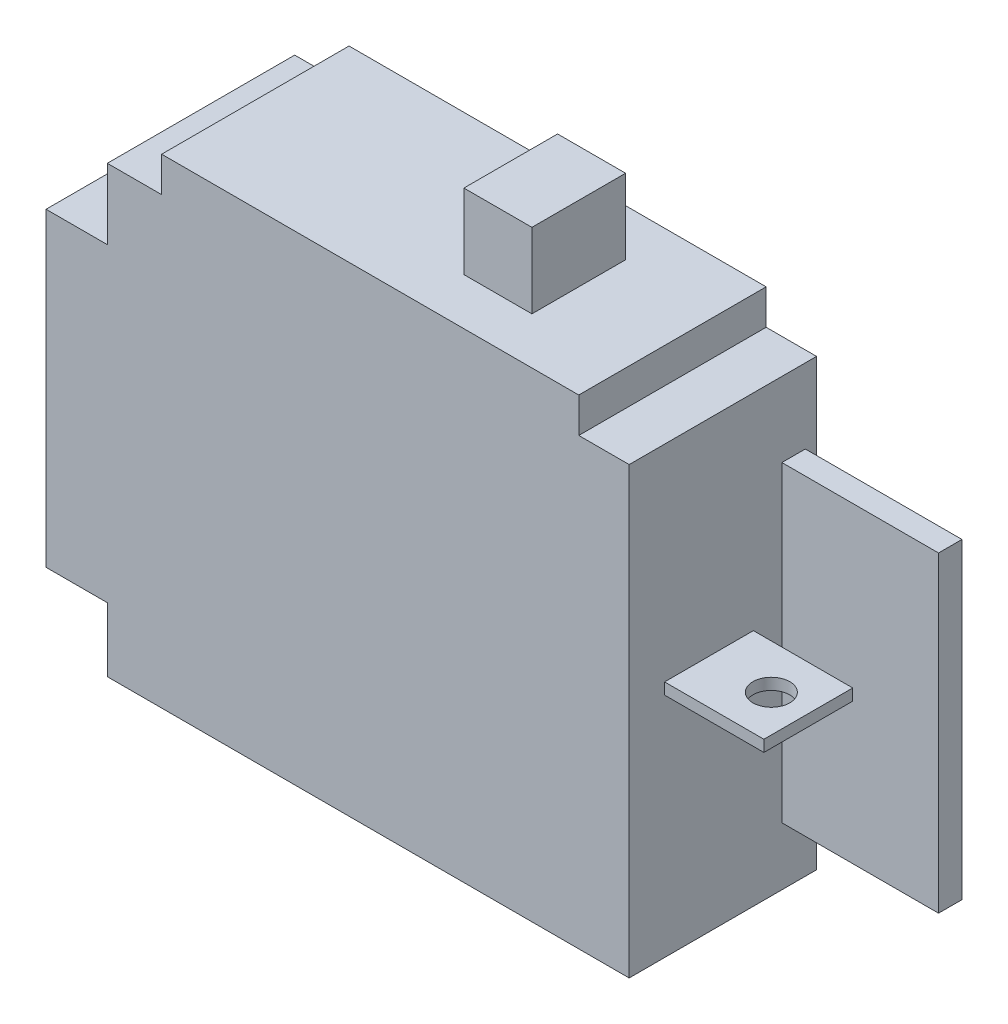
ISO-10303-21;
HEADER;
FILE_DESCRIPTION(('STEP AP214'),'2;1');
FILE_NAME('part.step','',(''),(''),'','','');
FILE_SCHEMA(('AUTOMOTIVE_DESIGN { 1 0 10303 214 1 1 1 1 }'));
ENDSEC;
DATA;
#1=APPLICATION_CONTEXT('core data for automotive mechanical design processes');
#2=APPLICATION_PROTOCOL_DEFINITION('international standard','automotive_design',2000,#1);
#3=PRODUCT_CONTEXT('',#1,'mechanical');
#4=PRODUCT('Part','Part','',(#3));
#5=PRODUCT_RELATED_PRODUCT_CATEGORY('part','',(#4));
#6=PRODUCT_DEFINITION_FORMATION('','',#4);
#7=PRODUCT_DEFINITION_CONTEXT('part definition',#1,'design');
#8=PRODUCT_DEFINITION('design','',#6,#7);
#9=PRODUCT_DEFINITION_SHAPE('','',#8);
#10=(LENGTH_UNIT() NAMED_UNIT(*) SI_UNIT(.MILLI.,.METRE.));
#11=(NAMED_UNIT(*) PLANE_ANGLE_UNIT() SI_UNIT($,.RADIAN.));
#12=(NAMED_UNIT(*) SI_UNIT($,.STERADIAN.) SOLID_ANGLE_UNIT());
#13=UNCERTAINTY_MEASURE_WITH_UNIT(LENGTH_MEASURE(1.E-05),#10,'distance_accuracy_value','');
#14=(GEOMETRIC_REPRESENTATION_CONTEXT(3) GLOBAL_UNCERTAINTY_ASSIGNED_CONTEXT((#13)) GLOBAL_UNIT_ASSIGNED_CONTEXT((#10,
#11,#12)) REPRESENTATION_CONTEXT('',''));
#15=CARTESIAN_POINT('',(0.,0.,0.));
#16=DIRECTION('',(0.,0.,1.));
#17=DIRECTION('',(1.,0.,0.));
#18=AXIS2_PLACEMENT_3D('',#15,#16,#17);
#19=CARTESIAN_POINT('',(6.61669999999999,45.0469,25.4));
#20=DIRECTION('',(1.,0.,0.));
#21=DIRECTION('',(0.,0.,-1.));
#22=AXIS2_PLACEMENT_3D('',#19,#20,#21);
#23=PLANE('',#22);
#24=DIRECTION('',(0.,1.,0.));
#25=VECTOR('',#24,1.);
#26=CARTESIAN_POINT('',(6.61669999999999,45.0469,6.35));
#27=LINE('',#26,#25);
#28=CARTESIAN_POINT('',(6.61669999999999,34.8869,6.35));
#29=VERTEX_POINT('',#28);
#30=CARTESIAN_POINT('',(6.61669999999999,45.0469,6.35));
#31=VERTEX_POINT('',#30);
#32=EDGE_CURVE('E206',#29,#31,#27,.T.);
#33=ORIENTED_EDGE('',*,*,#32,.F.);
#34=DIRECTION('',(0.,0.,-1.));
#35=VECTOR('',#34,1.);
#36=CARTESIAN_POINT('',(6.61669999999999,34.8869,25.4));
#37=LINE('',#36,#35);
#38=CARTESIAN_POINT('',(6.61669999999999,34.8869,19.05));
#39=VERTEX_POINT('',#38);
#40=EDGE_CURVE('E11',#39,#29,#37,.T.);
#41=ORIENTED_EDGE('',*,*,#40,.F.);
#42=DIRECTION('',(0.,-1.,0.));
#43=VECTOR('',#42,1.);
#44=CARTESIAN_POINT('',(6.61669999999999,45.0469,19.05));
#45=LINE('',#44,#43);
#46=CARTESIAN_POINT('',(6.61669999999999,45.0469,19.05));
#47=VERTEX_POINT('',#46);
#48=EDGE_CURVE('E476',#47,#39,#45,.T.);
#49=ORIENTED_EDGE('',*,*,#48,.F.);
#50=DIRECTION('',(0.,0.,-1.));
#51=VECTOR('',#50,1.);
#52=CARTESIAN_POINT('',(6.61669999999999,45.0469,25.4));
#53=LINE('',#52,#51);
#54=EDGE_CURVE('E229',#47,#31,#53,.T.);
#55=ORIENTED_EDGE('',*,*,#54,.T.);
#56=EDGE_LOOP('',(#33,#41,#49,#55));
#57=FACE_BOUND('',#56,.T.);
#58=ADVANCED_FACE('F38',(#57),#23,.F.);
#59=CARTESIAN_POINT('',(15.8369,34.8869,25.4));
#60=DIRECTION('',(-1.,0.,0.));
#61=DIRECTION('',(0.,0.,1.));
#62=AXIS2_PLACEMENT_3D('',#59,#60,#61);
#63=PLANE('',#62);
#64=DIRECTION('',(0.,-1.,0.));
#65=VECTOR('',#64,1.);
#66=CARTESIAN_POINT('',(15.8369,45.0469,6.35));
#67=LINE('',#66,#65);
#68=CARTESIAN_POINT('',(15.8369,45.0469,6.35));
#69=VERTEX_POINT('',#68);
#70=CARTESIAN_POINT('',(15.8369,34.8869,6.35));
#71=VERTEX_POINT('',#70);
#72=EDGE_CURVE('E207',#69,#71,#67,.T.);
#73=ORIENTED_EDGE('',*,*,#72,.F.);
#74=DIRECTION('',(0.,0.,-1.));
#75=VECTOR('',#74,1.);
#76=CARTESIAN_POINT('',(15.8369,45.0469,25.4));
#77=LINE('',#76,#75);
#78=CARTESIAN_POINT('',(15.8369,45.0469,19.05));
#79=VERTEX_POINT('',#78);
#80=EDGE_CURVE('E223',#79,#69,#77,.T.);
#81=ORIENTED_EDGE('',*,*,#80,.F.);
#82=DIRECTION('',(0.,1.,0.));
#83=VECTOR('',#82,1.);
#84=CARTESIAN_POINT('',(15.8369,45.0469,19.05));
#85=LINE('',#84,#83);
#86=CARTESIAN_POINT('',(15.8369,34.8869,19.05));
#87=VERTEX_POINT('',#86);
#88=EDGE_CURVE('E220',#87,#79,#85,.T.);
#89=ORIENTED_EDGE('',*,*,#88,.F.);
#90=DIRECTION('',(0.,0.,-1.));
#91=VECTOR('',#90,1.);
#92=CARTESIAN_POINT('',(15.8369,34.8869,25.4));
#93=LINE('',#92,#91);
#94=EDGE_CURVE('E201',#87,#71,#93,.T.);
#95=ORIENTED_EDGE('',*,*,#94,.T.);
#96=EDGE_LOOP('',(#73,#81,#89,#95));
#97=FACE_BOUND('',#96,.T.);
#98=ADVANCED_FACE('F219',(#97),#63,.F.);
#99=CARTESIAN_POINT('',(15.8369,45.0469,25.4));
#100=DIRECTION('',(0.,-1.,0.));
#101=DIRECTION('',(0.,0.,-1.));
#102=AXIS2_PLACEMENT_3D('',#99,#100,#101);
#103=PLANE('',#102);
#104=DIRECTION('',(1.,0.,0.));
#105=VECTOR('',#104,1.);
#106=CARTESIAN_POINT('',(15.8369,45.0469,6.35));
#107=LINE('',#106,#105);
#108=EDGE_CURVE('E212',#31,#69,#107,.T.);
#109=ORIENTED_EDGE('',*,*,#108,.F.);
#110=ORIENTED_EDGE('',*,*,#54,.F.);
#111=DIRECTION('',(-1.,0.,0.));
#112=VECTOR('',#111,1.);
#113=CARTESIAN_POINT('',(6.61669999999999,45.0469,19.05));
#114=LINE('',#113,#112);
#115=EDGE_CURVE('E468',#79,#47,#114,.T.);
#116=ORIENTED_EDGE('',*,*,#115,.F.);
#117=ORIENTED_EDGE('',*,*,#80,.T.);
#118=EDGE_LOOP('',(#109,#110,#116,#117));
#119=FACE_BOUND('',#118,.T.);
#120=ADVANCED_FACE('F484',(#119),#103,.F.);
#121=CARTESIAN_POINT('',(-28.0035,30.1371,25.4));
#122=DIRECTION('',(-1.,0.,0.));
#123=DIRECTION('',(0.,0.,1.));
#124=AXIS2_PLACEMENT_3D('',#121,#122,#123);
#125=PLANE('',#124);
#126=DIRECTION('',(0.,1.,0.));
#127=VECTOR('',#126,1.);
#128=CARTESIAN_POINT('',(-28.0035,30.1371,0.));
#129=LINE('',#128,#127);
#130=CARTESIAN_POINT('',(-28.0035,30.1371,0.));
#131=VERTEX_POINT('',#130);
#132=CARTESIAN_POINT('',(-28.0035,34.8869,0.));
#133=VERTEX_POINT('',#132);
#134=EDGE_CURVE('E270',#131,#133,#129,.T.);
#135=ORIENTED_EDGE('',*,*,#134,.F.);
#136=DIRECTION('',(0.,0.,-1.));
#137=VECTOR('',#136,1.);
#138=CARTESIAN_POINT('',(-28.0035,30.1371,25.4));
#139=LINE('',#138,#137);
#140=CARTESIAN_POINT('',(-28.0035,30.1371,25.4));
#141=VERTEX_POINT('',#140);
#142=EDGE_CURVE('E260',#141,#131,#139,.T.);
#143=ORIENTED_EDGE('',*,*,#142,.F.);
#144=DIRECTION('',(0.,1.,0.));
#145=VECTOR('',#144,1.);
#146=CARTESIAN_POINT('',(-28.0035,30.1371,25.4));
#147=LINE('',#146,#145);
#148=CARTESIAN_POINT('',(-28.0035,34.8869,25.4));
#149=VERTEX_POINT('',#148);
#150=EDGE_CURVE('E273',#141,#149,#147,.T.);
#151=ORIENTED_EDGE('',*,*,#150,.T.);
#152=DIRECTION('',(0.,0.,-1.));
#153=VECTOR('',#152,1.);
#154=CARTESIAN_POINT('',(-28.0035,34.8869,25.4));
#155=LINE('',#154,#153);
#156=EDGE_CURVE('E46',#149,#133,#155,.T.);
#157=ORIENTED_EDGE('',*,*,#156,.T.);
#158=EDGE_LOOP('',(#135,#143,#151,#157));
#159=FACE_BOUND('',#158,.T.);
#160=ADVANCED_FACE('F269',(#159),#125,.T.);
#161=CARTESIAN_POINT('',(-35.3695,30.1371,25.4));
#162=DIRECTION('',(0.,1.,0.));
#163=DIRECTION('',(0.,0.,1.));
#164=AXIS2_PLACEMENT_3D('',#161,#162,#163);
#165=PLANE('',#164);
#166=DIRECTION('',(1.,0.,0.));
#167=VECTOR('',#166,1.);
#168=CARTESIAN_POINT('',(-35.3695,30.1371,0.));
#169=LINE('',#168,#167);
#170=CARTESIAN_POINT('',(-35.3695,30.1371,0.));
#171=VERTEX_POINT('',#170);
#172=EDGE_CURVE('E283',#171,#131,#169,.T.);
#173=ORIENTED_EDGE('',*,*,#172,.F.);
#174=DIRECTION('',(0.,0.,-1.));
#175=VECTOR('',#174,1.);
#176=CARTESIAN_POINT('',(-35.3695,30.1371,25.4));
#177=LINE('',#176,#175);
#178=CARTESIAN_POINT('',(-35.3695,30.1371,25.4));
#179=VERTEX_POINT('',#178);
#180=EDGE_CURVE('E257',#179,#171,#177,.T.);
#181=ORIENTED_EDGE('',*,*,#180,.F.);
#182=DIRECTION('',(1.,0.,0.));
#183=VECTOR('',#182,1.);
#184=CARTESIAN_POINT('',(-35.3695,30.1371,25.4));
#185=LINE('',#184,#183);
#186=EDGE_CURVE('E374',#179,#141,#185,.T.);
#187=ORIENTED_EDGE('',*,*,#186,.T.);
#188=ORIENTED_EDGE('',*,*,#142,.T.);
#189=EDGE_LOOP('',(#173,#181,#187,#188));
#190=FACE_BOUND('',#189,.T.);
#191=ADVANCED_FACE('F535',(#190),#165,.T.);
#192=CARTESIAN_POINT('',(-35.3695,20.5867,25.4));
#193=DIRECTION('',(-1.,0.,0.));
#194=DIRECTION('',(0.,0.,1.));
#195=AXIS2_PLACEMENT_3D('',#192,#193,#194);
#196=PLANE('',#195);
#197=DIRECTION('',(0.,1.,0.));
#198=VECTOR('',#197,1.);
#199=CARTESIAN_POINT('',(-35.3695,20.5867,0.));
#200=LINE('',#199,#198);
#201=CARTESIAN_POINT('',(-35.3695,20.5867,0.));
#202=VERTEX_POINT('',#201);
#203=EDGE_CURVE('E289',#202,#171,#200,.T.);
#204=ORIENTED_EDGE('',*,*,#203,.F.);
#205=DIRECTION('',(0.,0.,-1.));
#206=VECTOR('',#205,1.);
#207=CARTESIAN_POINT('',(-35.3695,20.5867,25.4));
#208=LINE('',#207,#206);
#209=CARTESIAN_POINT('',(-35.3695,20.5867,25.4));
#210=VERTEX_POINT('',#209);
#211=EDGE_CURVE('E254',#210,#202,#208,.T.);
#212=ORIENTED_EDGE('',*,*,#211,.F.);
#213=DIRECTION('',(0.,1.,0.));
#214=VECTOR('',#213,1.);
#215=CARTESIAN_POINT('',(-35.3695,20.5867,25.4));
#216=LINE('',#215,#214);
#217=EDGE_CURVE('E370',#210,#179,#216,.T.);
#218=ORIENTED_EDGE('',*,*,#217,.T.);
#219=ORIENTED_EDGE('',*,*,#180,.T.);
#220=EDGE_LOOP('',(#204,#212,#218,#219));
#221=FACE_BOUND('',#220,.T.);
#222=ADVANCED_FACE('F531',(#221),#196,.T.);
#223=CARTESIAN_POINT('',(-43.6753,20.5867,25.4));
#224=DIRECTION('',(0.,1.,0.));
#225=DIRECTION('',(0.,0.,1.));
#226=AXIS2_PLACEMENT_3D('',#223,#224,#225);
#227=PLANE('',#226);
#228=DIRECTION('',(1.,0.,0.));
#229=VECTOR('',#228,1.);
#230=CARTESIAN_POINT('',(-43.6753,20.5867,0.));
#231=LINE('',#230,#229);
#232=CARTESIAN_POINT('',(-43.6753,20.5867,0.));
#233=VERTEX_POINT('',#232);
#234=EDGE_CURVE('E300',#233,#202,#231,.T.);
#235=ORIENTED_EDGE('',*,*,#234,.F.);
#236=DIRECTION('',(0.,0.,-1.));
#237=VECTOR('',#236,1.);
#238=CARTESIAN_POINT('',(-43.6753,20.5867,25.4));
#239=LINE('',#238,#237);
#240=CARTESIAN_POINT('',(-43.6753,20.5867,25.4));
#241=VERTEX_POINT('',#240);
#242=EDGE_CURVE('E251',#241,#233,#239,.T.);
#243=ORIENTED_EDGE('',*,*,#242,.F.);
#244=DIRECTION('',(1.,0.,0.));
#245=VECTOR('',#244,1.);
#246=CARTESIAN_POINT('',(-43.6753,20.5867,25.4));
#247=LINE('',#246,#245);
#248=EDGE_CURVE('E366',#241,#210,#247,.T.);
#249=ORIENTED_EDGE('',*,*,#248,.T.);
#250=ORIENTED_EDGE('',*,*,#211,.T.);
#251=EDGE_LOOP('',(#235,#243,#249,#250));
#252=FACE_BOUND('',#251,.T.);
#253=ADVANCED_FACE('F527',(#252),#227,.T.);
#254=CARTESIAN_POINT('',(-43.6753,-21.4503,25.4));
#255=DIRECTION('',(-1.,0.,0.));
#256=DIRECTION('',(0.,0.,1.));
#257=AXIS2_PLACEMENT_3D('',#254,#255,#256);
#258=PLANE('',#257);
#259=DIRECTION('',(0.,1.,0.));
#260=VECTOR('',#259,1.);
#261=CARTESIAN_POINT('',(-43.6753,-21.4503,0.));
#262=LINE('',#261,#260);
#263=CARTESIAN_POINT('',(-43.6753,-21.4503,0.));
#264=VERTEX_POINT('',#263);
#265=EDGE_CURVE('E304',#264,#233,#262,.T.);
#266=ORIENTED_EDGE('',*,*,#265,.F.);
#267=DIRECTION('',(0.,0.,-1.));
#268=VECTOR('',#267,1.);
#269=CARTESIAN_POINT('',(-43.6753,-21.4503,25.4));
#270=LINE('',#269,#268);
#271=CARTESIAN_POINT('',(-43.6753,-21.4503,25.4));
#272=VERTEX_POINT('',#271);
#273=EDGE_CURVE('E248',#272,#264,#270,.T.);
#274=ORIENTED_EDGE('',*,*,#273,.F.);
#275=DIRECTION('',(0.,1.,0.));
#276=VECTOR('',#275,1.);
#277=CARTESIAN_POINT('',(-43.6753,-21.4503,25.4));
#278=LINE('',#277,#276);
#279=EDGE_CURVE('E362',#272,#241,#278,.T.);
#280=ORIENTED_EDGE('',*,*,#279,.T.);
#281=ORIENTED_EDGE('',*,*,#242,.T.);
#282=EDGE_LOOP('',(#266,#274,#280,#281));
#283=FACE_BOUND('',#282,.T.);
#284=ADVANCED_FACE('F523',(#283),#258,.T.);
#285=CARTESIAN_POINT('',(-35.3695,-21.4503,25.4));
#286=DIRECTION('',(0.,-1.,0.));
#287=DIRECTION('',(0.,0.,-1.));
#288=AXIS2_PLACEMENT_3D('',#285,#286,#287);
#289=PLANE('',#288);
#290=DIRECTION('',(-1.,0.,0.));
#291=VECTOR('',#290,1.);
#292=CARTESIAN_POINT('',(-35.3695,-21.4503,0.));
#293=LINE('',#292,#291);
#294=CARTESIAN_POINT('',(-35.3695,-21.4503,0.));
#295=VERTEX_POINT('',#294);
#296=EDGE_CURVE('E308',#295,#264,#293,.T.);
#297=ORIENTED_EDGE('',*,*,#296,.F.);
#298=DIRECTION('',(0.,0.,-1.));
#299=VECTOR('',#298,1.);
#300=CARTESIAN_POINT('',(-35.3695,-21.4503,25.4));
#301=LINE('',#300,#299);
#302=CARTESIAN_POINT('',(-35.3695,-21.4503,25.4));
#303=VERTEX_POINT('',#302);
#304=EDGE_CURVE('E245',#303,#295,#301,.T.);
#305=ORIENTED_EDGE('',*,*,#304,.F.);
#306=DIRECTION('',(-1.,0.,0.));
#307=VECTOR('',#306,1.);
#308=CARTESIAN_POINT('',(-35.3695,-21.4503,25.4));
#309=LINE('',#308,#307);
#310=EDGE_CURVE('E358',#303,#272,#309,.T.);
#311=ORIENTED_EDGE('',*,*,#310,.T.);
#312=ORIENTED_EDGE('',*,*,#273,.T.);
#313=EDGE_LOOP('',(#297,#305,#311,#312));
#314=FACE_BOUND('',#313,.T.);
#315=ADVANCED_FACE('F519',(#314),#289,.T.);
#316=CARTESIAN_POINT('',(-35.3695,-30.1371,25.4));
#317=DIRECTION('',(-1.,0.,0.));
#318=DIRECTION('',(0.,0.,1.));
#319=AXIS2_PLACEMENT_3D('',#316,#317,#318);
#320=PLANE('',#319);
#321=DIRECTION('',(0.,1.,0.));
#322=VECTOR('',#321,1.);
#323=CARTESIAN_POINT('',(-35.3695,-30.1371,0.));
#324=LINE('',#323,#322);
#325=CARTESIAN_POINT('',(-35.3695,-30.1371,0.));
#326=VERTEX_POINT('',#325);
#327=EDGE_CURVE('E312',#326,#295,#324,.T.);
#328=ORIENTED_EDGE('',*,*,#327,.F.);
#329=DIRECTION('',(0.,0.,-1.));
#330=VECTOR('',#329,1.);
#331=CARTESIAN_POINT('',(-35.3695,-30.1371,25.4));
#332=LINE('',#331,#330);
#333=CARTESIAN_POINT('',(-35.3695,-30.1371,25.4));
#334=VERTEX_POINT('',#333);
#335=EDGE_CURVE('E242',#334,#326,#332,.T.);
#336=ORIENTED_EDGE('',*,*,#335,.F.);
#337=DIRECTION('',(0.,1.,0.));
#338=VECTOR('',#337,1.);
#339=CARTESIAN_POINT('',(-35.3695,-30.1371,25.4));
#340=LINE('',#339,#338);
#341=EDGE_CURVE('E354',#334,#303,#340,.T.);
#342=ORIENTED_EDGE('',*,*,#341,.T.);
#343=ORIENTED_EDGE('',*,*,#304,.T.);
#344=EDGE_LOOP('',(#328,#336,#342,#343));
#345=FACE_BOUND('',#344,.T.);
#346=ADVANCED_FACE('F515',(#345),#320,.T.);
#347=CARTESIAN_POINT('',(-35.3695,-30.1371,25.4));
#348=DIRECTION('',(0.,1.,0.));
#349=DIRECTION('',(0.,0.,1.));
#350=AXIS2_PLACEMENT_3D('',#347,#348,#349);
#351=PLANE('',#350);
#352=DIRECTION('',(1.,0.,0.));
#353=VECTOR('',#352,1.);
#354=CARTESIAN_POINT('',(-35.3695,-30.1371,0.));
#355=LINE('',#354,#353);
#356=CARTESIAN_POINT('',(35.3695,-30.1371,0.));
#357=VERTEX_POINT('',#356);
#358=EDGE_CURVE('E316',#326,#357,#355,.T.);
#359=ORIENTED_EDGE('',*,*,#358,.T.);
#360=DIRECTION('',(0.,0.,-1.));
#361=VECTOR('',#360,1.);
#362=CARTESIAN_POINT('',(35.3695,-30.1371,25.4));
#363=LINE('',#362,#361);
#364=CARTESIAN_POINT('',(35.3695,-30.1371,25.4));
#365=VERTEX_POINT('',#364);
#366=EDGE_CURVE('E238',#365,#357,#363,.T.);
#367=ORIENTED_EDGE('',*,*,#366,.F.);
#368=DIRECTION('',(1.,0.,0.));
#369=VECTOR('',#368,1.);
#370=CARTESIAN_POINT('',(-35.3695,-30.1371,25.4));
#371=LINE('',#370,#369);
#372=EDGE_CURVE('E349',#334,#365,#371,.T.);
#373=ORIENTED_EDGE('',*,*,#372,.F.);
#374=ORIENTED_EDGE('',*,*,#335,.T.);
#375=EDGE_LOOP('',(#359,#367,#373,#374));
#376=FACE_BOUND('',#375,.T.);
#377=ADVANCED_FACE('F512',(#376),#351,.F.);
#378=CARTESIAN_POINT('',(35.3695,-30.1371,25.4));
#379=DIRECTION('',(-1.,0.,0.));
#380=DIRECTION('',(0.,0.,1.));
#381=AXIS2_PLACEMENT_3D('',#378,#379,#380);
#382=PLANE('',#381);
#383=DIRECTION('',(0.,-1.,0.));
#384=VECTOR('',#383,1.);
#385=CARTESIAN_POINT('',(35.3695,2.22250000000001,8.5598));
#386=LINE('',#385,#384);
#387=CARTESIAN_POINT('',(35.3695,2.22250000000001,8.5598));
#388=VERTEX_POINT('',#387);
#389=CARTESIAN_POINT('',(35.3695,0.673100000000006,8.5598));
#390=VERTEX_POINT('',#389);
#391=EDGE_CURVE('E53',#388,#390,#386,.T.);
#392=ORIENTED_EDGE('',*,*,#391,.T.);
#393=DIRECTION('',(0.,0.,1.));
#394=VECTOR('',#393,1.);
#395=CARTESIAN_POINT('',(35.3695,0.673100000000006,8.5598));
#396=LINE('',#395,#394);
#397=CARTESIAN_POINT('',(35.3695,0.673100000000006,20.5994));
#398=VERTEX_POINT('',#397);
#399=EDGE_CURVE('E445',#390,#398,#396,.T.);
#400=ORIENTED_EDGE('',*,*,#399,.T.);
#401=DIRECTION('',(0.,-1.,0.));
#402=VECTOR('',#401,1.);
#403=CARTESIAN_POINT('',(35.3695,2.22250000000001,20.5994));
#404=LINE('',#403,#402);
#405=CARTESIAN_POINT('',(35.3695,2.22250000000001,20.5994));
#406=VERTEX_POINT('',#405);
#407=EDGE_CURVE('E441',#406,#398,#404,.T.);
#408=ORIENTED_EDGE('',*,*,#407,.F.);
#409=DIRECTION('',(0.,0.,1.));
#410=VECTOR('',#409,1.);
#411=CARTESIAN_POINT('',(35.3695,2.22250000000001,8.5598));
#412=LINE('',#411,#410);
#413=EDGE_CURVE('E58',#388,#406,#412,.T.);
#414=ORIENTED_EDGE('',*,*,#413,.F.);
#415=EDGE_LOOP('',(#392,#400,#408,#414));
#416=FACE_BOUND('',#415,.T.);
#417=DIRECTION('',(0.,-1.,0.));
#418=VECTOR('',#417,1.);
#419=CARTESIAN_POINT('',(35.3695,20.0256641299236,1.524));
#420=LINE('',#419,#418);
#421=CARTESIAN_POINT('',(35.3695,20.0256641299236,1.524));
#422=VERTEX_POINT('',#421);
#423=CARTESIAN_POINT('',(35.3695,-22.2653358700764,1.52399999999999));
#424=VERTEX_POINT('',#423);
#425=EDGE_CURVE('E394',#422,#424,#420,.T.);
#426=ORIENTED_EDGE('',*,*,#425,.T.);
#427=DIRECTION('',(0.,0.,1.));
#428=VECTOR('',#427,1.);
#429=CARTESIAN_POINT('',(35.3695,-22.2653358700764,1.524));
#430=LINE('',#429,#428);
#431=CARTESIAN_POINT('',(35.3695,-22.2653358700764,4.69899999999999));
#432=VERTEX_POINT('',#431);
#433=EDGE_CURVE('E406',#424,#432,#430,.T.);
#434=ORIENTED_EDGE('',*,*,#433,.T.);
#435=DIRECTION('',(0.,-1.,0.));
#436=VECTOR('',#435,1.);
#437=CARTESIAN_POINT('',(35.3695,20.0256641299236,4.69899999999999));
#438=LINE('',#437,#436);
#439=CARTESIAN_POINT('',(35.3695,20.0256641299236,4.69899999999999));
#440=VERTEX_POINT('',#439);
#441=EDGE_CURVE('E402',#440,#432,#438,.T.);
#442=ORIENTED_EDGE('',*,*,#441,.F.);
#443=DIRECTION('',(0.,0.,1.));
#444=VECTOR('',#443,1.);
#445=CARTESIAN_POINT('',(35.3695,20.0256641299236,1.524));
#446=LINE('',#445,#444);
#447=EDGE_CURVE('E398',#422,#440,#446,.T.);
#448=ORIENTED_EDGE('',*,*,#447,.F.);
#449=EDGE_LOOP('',(#426,#434,#442,#448));
#450=FACE_BOUND('',#449,.T.);
#451=DIRECTION('',(0.,1.,0.));
#452=VECTOR('',#451,1.);
#453=CARTESIAN_POINT('',(35.3695,-30.1371,0.));
#454=LINE('',#453,#452);
#455=CARTESIAN_POINT('',(35.3695,30.1371,0.));
#456=VERTEX_POINT('',#455);
#457=EDGE_CURVE('E319',#357,#456,#454,.T.);
#458=ORIENTED_EDGE('',*,*,#457,.T.);
#459=DIRECTION('',(0.,0.,-1.));
#460=VECTOR('',#459,1.);
#461=CARTESIAN_POINT('',(35.3695,30.1371,25.4));
#462=LINE('',#461,#460);
#463=CARTESIAN_POINT('',(35.3695,30.1371,25.4));
#464=VERTEX_POINT('',#463);
#465=EDGE_CURVE('E235',#464,#456,#462,.T.);
#466=ORIENTED_EDGE('',*,*,#465,.F.);
#467=DIRECTION('',(0.,1.,0.));
#468=VECTOR('',#467,1.);
#469=CARTESIAN_POINT('',(35.3695,-30.1371,25.4));
#470=LINE('',#469,#468);
#471=EDGE_CURVE('E345',#365,#464,#470,.T.);
#472=ORIENTED_EDGE('',*,*,#471,.F.);
#473=ORIENTED_EDGE('',*,*,#366,.T.);
#474=EDGE_LOOP('',(#458,#466,#472,#473));
#475=FACE_BOUND('',#474,.T.);
#476=ADVANCED_FACE('F509',(#416,#450,#475),#382,.F.);
#477=CARTESIAN_POINT('',(28.5369,30.1371,25.4));
#478=DIRECTION('',(0.,1.,0.));
#479=DIRECTION('',(0.,0.,1.));
#480=AXIS2_PLACEMENT_3D('',#477,#478,#479);
#481=PLANE('',#480);
#482=DIRECTION('',(1.,0.,0.));
#483=VECTOR('',#482,1.);
#484=CARTESIAN_POINT('',(28.5369,30.1371,0.));
#485=LINE('',#484,#483);
#486=CARTESIAN_POINT('',(28.5369,30.1371,0.));
#487=VERTEX_POINT('',#486);
#488=EDGE_CURVE('E323',#487,#456,#485,.T.);
#489=ORIENTED_EDGE('',*,*,#488,.F.);
#490=DIRECTION('',(0.,0.,-1.));
#491=VECTOR('',#490,1.);
#492=CARTESIAN_POINT('',(28.5369,30.1371,25.4));
#493=LINE('',#492,#491);
#494=CARTESIAN_POINT('',(28.5369,30.1371,25.4));
#495=VERTEX_POINT('',#494);
#496=EDGE_CURVE('E227',#495,#487,#493,.T.);
#497=ORIENTED_EDGE('',*,*,#496,.F.);
#498=DIRECTION('',(1.,0.,0.));
#499=VECTOR('',#498,1.);
#500=CARTESIAN_POINT('',(28.5369,30.1371,25.4));
#501=LINE('',#500,#499);
#502=EDGE_CURVE('E339',#495,#464,#501,.T.);
#503=ORIENTED_EDGE('',*,*,#502,.T.);
#504=ORIENTED_EDGE('',*,*,#465,.T.);
#505=EDGE_LOOP('',(#489,#497,#503,#504));
#506=FACE_BOUND('',#505,.T.);
#507=ADVANCED_FACE('F506',(#506),#481,.T.);
#508=CARTESIAN_POINT('',(28.5369,34.8869,25.4));
#509=DIRECTION('',(1.,0.,0.));
#510=DIRECTION('',(0.,1.,0.));
#511=AXIS2_PLACEMENT_3D('',#508,#509,#510);
#512=PLANE('',#511);
#513=DIRECTION('',(0.,-1.,0.));
#514=VECTOR('',#513,1.);
#515=CARTESIAN_POINT('',(28.5369,34.8869,0.));
#516=LINE('',#515,#514);
#517=CARTESIAN_POINT('',(28.5369,34.8869,0.));
#518=VERTEX_POINT('',#517);
#519=EDGE_CURVE('E327',#518,#487,#516,.T.);
#520=ORIENTED_EDGE('',*,*,#519,.F.);
#521=DIRECTION('',(0.,0.,-1.));
#522=VECTOR('',#521,1.);
#523=CARTESIAN_POINT('',(28.5369,34.8869,25.4));
#524=LINE('',#523,#522);
#525=CARTESIAN_POINT('',(28.5369,34.8869,25.4));
#526=VERTEX_POINT('',#525);
#527=EDGE_CURVE('E222',#526,#518,#524,.T.);
#528=ORIENTED_EDGE('',*,*,#527,.F.);
#529=DIRECTION('',(0.,-1.,0.));
#530=VECTOR('',#529,1.);
#531=CARTESIAN_POINT('',(28.5369,34.8869,25.4));
#532=LINE('',#531,#530);
#533=EDGE_CURVE('E295',#526,#495,#532,.T.);
#534=ORIENTED_EDGE('',*,*,#533,.T.);
#535=ORIENTED_EDGE('',*,*,#496,.T.);
#536=EDGE_LOOP('',(#520,#528,#534,#535));
#537=FACE_BOUND('',#536,.T.);
#538=ADVANCED_FACE('F503',(#537),#512,.T.);
#539=CARTESIAN_POINT('',(28.5369,34.8869,25.4));
#540=DIRECTION('',(0.,-1.,0.));
#541=DIRECTION('',(0.,0.,-1.));
#542=AXIS2_PLACEMENT_3D('',#539,#540,#541);
#543=PLANE('',#542);
#544=DIRECTION('',(-1.,0.,0.));
#545=VECTOR('',#544,1.);
#546=CARTESIAN_POINT('',(28.5369,34.8869,0.));
#547=LINE('',#546,#545);
#548=EDGE_CURVE('E279',#518,#133,#547,.T.);
#549=ORIENTED_EDGE('',*,*,#548,.T.);
#550=ORIENTED_EDGE('',*,*,#156,.F.);
#551=DIRECTION('',(-1.,0.,0.));
#552=VECTOR('',#551,1.);
#553=CARTESIAN_POINT('',(6.61669999999999,34.8869,25.4));
#554=LINE('',#553,#552);
#555=EDGE_CURVE('E331',#526,#149,#554,.T.);
#556=ORIENTED_EDGE('',*,*,#555,.F.);
#557=ORIENTED_EDGE('',*,*,#527,.T.);
#558=EDGE_LOOP('',(#549,#550,#556,#557));
#559=FACE_BOUND('',#558,.T.);
#560=DIRECTION('',(-1.,0.,0.));
#561=VECTOR('',#560,1.);
#562=CARTESIAN_POINT('',(15.8369,34.8869,6.35));
#563=LINE('',#562,#561);
#564=EDGE_CURVE('E197',#71,#29,#563,.T.);
#565=ORIENTED_EDGE('',*,*,#564,.F.);
#566=ORIENTED_EDGE('',*,*,#94,.F.);
#567=DIRECTION('',(1.,0.,0.));
#568=VECTOR('',#567,1.);
#569=CARTESIAN_POINT('',(6.61669999999999,34.8869,19.05));
#570=LINE('',#569,#568);
#571=EDGE_CURVE('E473',#39,#87,#570,.T.);
#572=ORIENTED_EDGE('',*,*,#571,.F.);
#573=ORIENTED_EDGE('',*,*,#40,.T.);
#574=EDGE_LOOP('',(#565,#566,#572,#573));
#575=FACE_BOUND('',#574,.T.);
#576=ADVANCED_FACE('F199',(#559,#575),#543,.F.);
#577=CARTESIAN_POINT('',(0.,0.,25.4));
#578=DIRECTION('',(0.,0.,-1.));
#579=DIRECTION('',(-1.,0.,0.));
#580=AXIS2_PLACEMENT_3D('',#577,#578,#579);
#581=PLANE('',#580);
#582=ORIENTED_EDGE('',*,*,#533,.F.);
#583=ORIENTED_EDGE('',*,*,#555,.T.);
#584=ORIENTED_EDGE('',*,*,#150,.F.);
#585=ORIENTED_EDGE('',*,*,#186,.F.);
#586=ORIENTED_EDGE('',*,*,#217,.F.);
#587=ORIENTED_EDGE('',*,*,#248,.F.);
#588=ORIENTED_EDGE('',*,*,#279,.F.);
#589=ORIENTED_EDGE('',*,*,#310,.F.);
#590=ORIENTED_EDGE('',*,*,#341,.F.);
#591=ORIENTED_EDGE('',*,*,#372,.T.);
#592=ORIENTED_EDGE('',*,*,#471,.T.);
#593=ORIENTED_EDGE('',*,*,#502,.F.);
#594=EDGE_LOOP('',(#582,#583,#584,#585,#586,#587,#588,#589,#590,#591,#592,#593));
#595=FACE_BOUND('',#594,.T.);
#596=ADVANCED_FACE('F502',(#595),#581,.F.);
#597=CARTESIAN_POINT('',(0.,0.,0.));
#598=DIRECTION('',(0.,0.,-1.));
#599=DIRECTION('',(-1.,0.,0.));
#600=AXIS2_PLACEMENT_3D('',#597,#598,#599);
#601=PLANE('',#600);
#602=ORIENTED_EDGE('',*,*,#134,.T.);
#603=ORIENTED_EDGE('',*,*,#548,.F.);
#604=ORIENTED_EDGE('',*,*,#519,.T.);
#605=ORIENTED_EDGE('',*,*,#488,.T.);
#606=ORIENTED_EDGE('',*,*,#457,.F.);
#607=ORIENTED_EDGE('',*,*,#358,.F.);
#608=ORIENTED_EDGE('',*,*,#327,.T.);
#609=ORIENTED_EDGE('',*,*,#296,.T.);
#610=ORIENTED_EDGE('',*,*,#265,.T.);
#611=ORIENTED_EDGE('',*,*,#234,.T.);
#612=ORIENTED_EDGE('',*,*,#203,.T.);
#613=ORIENTED_EDGE('',*,*,#172,.T.);
#614=EDGE_LOOP('',(#602,#603,#604,#605,#606,#607,#608,#609,#610,#611,#612,#613));
#615=FACE_BOUND('',#614,.T.);
#616=ADVANCED_FACE('F277',(#615),#601,.T.);
#617=CARTESIAN_POINT('',(56.6039,-22.2653358700764,1.524));
#618=DIRECTION('',(0.,-1.,0.));
#619=DIRECTION('',(0.,0.,-1.));
#620=AXIS2_PLACEMENT_3D('',#617,#618,#619);
#621=PLANE('',#620);
#622=ORIENTED_EDGE('',*,*,#433,.F.);
#623=DIRECTION('',(-1.,0.,0.));
#624=VECTOR('',#623,1.);
#625=CARTESIAN_POINT('',(56.6039,-22.2653358700764,1.524));
#626=LINE('',#625,#624);
#627=CARTESIAN_POINT('',(56.6039,-22.2653358700764,1.524));
#628=VERTEX_POINT('',#627);
#629=EDGE_CURVE('E285',#628,#424,#626,.T.);
#630=ORIENTED_EDGE('',*,*,#629,.F.);
#631=DIRECTION('',(0.,0.,1.));
#632=VECTOR('',#631,1.);
#633=CARTESIAN_POINT('',(56.6039,-22.2653358700764,1.524));
#634=LINE('',#633,#632);
#635=CARTESIAN_POINT('',(56.6039,-22.2653358700764,4.69899999999999));
#636=VERTEX_POINT('',#635);
#637=EDGE_CURVE('E397',#628,#636,#634,.T.);
#638=ORIENTED_EDGE('',*,*,#637,.T.);
#639=DIRECTION('',(-1.,0.,0.));
#640=VECTOR('',#639,1.);
#641=CARTESIAN_POINT('',(56.6039,-22.2653358700764,4.69899999999999));
#642=LINE('',#641,#640);
#643=EDGE_CURVE('E382',#636,#432,#642,.T.);
#644=ORIENTED_EDGE('',*,*,#643,.T.);
#645=EDGE_LOOP('',(#622,#630,#638,#644));
#646=FACE_BOUND('',#645,.T.);
#647=ADVANCED_FACE('F603',(#646),#621,.T.);
#648=CARTESIAN_POINT('',(56.6039,20.0256641299236,1.524));
#649=DIRECTION('',(0.,0.,-1.));
#650=DIRECTION('',(0.,1.,0.));
#651=AXIS2_PLACEMENT_3D('',#648,#649,#650);
#652=PLANE('',#651);
#653=ORIENTED_EDGE('',*,*,#425,.F.);
#654=DIRECTION('',(-1.,0.,0.));
#655=VECTOR('',#654,1.);
#656=CARTESIAN_POINT('',(56.6039,20.0256641299236,1.524));
#657=LINE('',#656,#655);
#658=CARTESIAN_POINT('',(56.6039,20.0256641299236,1.524));
#659=VERTEX_POINT('',#658);
#660=EDGE_CURVE('E292',#659,#422,#657,.T.);
#661=ORIENTED_EDGE('',*,*,#660,.F.);
#662=DIRECTION('',(0.,-1.,0.));
#663=VECTOR('',#662,1.);
#664=CARTESIAN_POINT('',(56.6039,20.0256641299236,1.524));
#665=LINE('',#664,#663);
#666=EDGE_CURVE('E387',#659,#628,#665,.T.);
#667=ORIENTED_EDGE('',*,*,#666,.T.);
#668=ORIENTED_EDGE('',*,*,#629,.T.);
#669=EDGE_LOOP('',(#653,#661,#667,#668));
#670=FACE_BOUND('',#669,.T.);
#671=ADVANCED_FACE('F612',(#670),#652,.T.);
#672=CARTESIAN_POINT('',(56.6039,20.0256641299236,1.524));
#673=DIRECTION('',(0.,-1.,0.));
#674=DIRECTION('',(0.,0.,-1.));
#675=AXIS2_PLACEMENT_3D('',#672,#673,#674);
#676=PLANE('',#675);
#677=ORIENTED_EDGE('',*,*,#447,.T.);
#678=DIRECTION('',(-1.,0.,0.));
#679=VECTOR('',#678,1.);
#680=CARTESIAN_POINT('',(56.6039,20.0256641299236,4.69899999999999));
#681=LINE('',#680,#679);
#682=CARTESIAN_POINT('',(56.6039,20.0256641299236,4.69899999999999));
#683=VERTEX_POINT('',#682);
#684=EDGE_CURVE('E386',#683,#440,#681,.T.);
#685=ORIENTED_EDGE('',*,*,#684,.F.);
#686=DIRECTION('',(0.,0.,1.));
#687=VECTOR('',#686,1.);
#688=CARTESIAN_POINT('',(56.6039,20.0256641299236,1.524));
#689=LINE('',#688,#687);
#690=EDGE_CURVE('E413',#659,#683,#689,.T.);
#691=ORIENTED_EDGE('',*,*,#690,.F.);
#692=ORIENTED_EDGE('',*,*,#660,.T.);
#693=EDGE_LOOP('',(#677,#685,#691,#692));
#694=FACE_BOUND('',#693,.T.);
#695=ADVANCED_FACE('F619',(#694),#676,.F.);
#696=CARTESIAN_POINT('',(56.6039,20.0256641299236,4.69899999999999));
#697=DIRECTION('',(0.,0.,-1.));
#698=DIRECTION('',(-1.,0.,0.));
#699=AXIS2_PLACEMENT_3D('',#696,#697,#698);
#700=PLANE('',#699);
#701=ORIENTED_EDGE('',*,*,#441,.T.);
#702=ORIENTED_EDGE('',*,*,#643,.F.);
#703=DIRECTION('',(0.,-1.,0.));
#704=VECTOR('',#703,1.);
#705=CARTESIAN_POINT('',(56.6039,20.0256641299236,4.69899999999999));
#706=LINE('',#705,#704);
#707=EDGE_CURVE('E416',#683,#636,#706,.T.);
#708=ORIENTED_EDGE('',*,*,#707,.F.);
#709=ORIENTED_EDGE('',*,*,#684,.T.);
#710=EDGE_LOOP('',(#701,#702,#708,#709));
#711=FACE_BOUND('',#710,.T.);
#712=ADVANCED_FACE('F627',(#711),#700,.F.);
#713=CARTESIAN_POINT('',(56.6039,0.,0.));
#714=DIRECTION('',(1.,0.,0.));
#715=DIRECTION('',(0.,0.,-1.));
#716=AXIS2_PLACEMENT_3D('',#713,#714,#715);
#717=PLANE('',#716);
#718=ORIENTED_EDGE('',*,*,#637,.F.);
#719=ORIENTED_EDGE('',*,*,#666,.F.);
#720=ORIENTED_EDGE('',*,*,#690,.T.);
#721=ORIENTED_EDGE('',*,*,#707,.T.);
#722=EDGE_LOOP('',(#718,#719,#720,#721));
#723=FACE_BOUND('',#722,.T.);
#724=ADVANCED_FACE('F635',(#723),#717,.T.);
#725=CARTESIAN_POINT('',(48.8315,0.673100000000006,8.5598));
#726=DIRECTION('',(0.,-1.,0.));
#727=DIRECTION('',(0.,0.,-1.));
#728=AXIS2_PLACEMENT_3D('',#725,#726,#727);
#729=PLANE('',#728);
#730=CARTESIAN_POINT('',(43.82135,0.673100000000006,14.5796));
#731=DIRECTION('',(0.,-1.,0.));
#732=DIRECTION('',(0.,0.,-1.));
#733=AXIS2_PLACEMENT_3D('',#730,#731,#732);
#734=CIRCLE('',#733,2.49555);
#735=CARTESIAN_POINT('',(43.82135,0.673100000000006,12.08405));
#736=VERTEX_POINT('',#735);
#737=EDGE_CURVE('E448',#736,#736,#734,.T.);
#738=ORIENTED_EDGE('',*,*,#737,.F.);
#739=EDGE_LOOP('',(#738));
#740=FACE_BOUND('',#739,.T.);
#741=ORIENTED_EDGE('',*,*,#399,.F.);
#742=DIRECTION('',(-1.,0.,0.));
#743=VECTOR('',#742,1.);
#744=CARTESIAN_POINT('',(48.8315,0.673100000000006,8.5598));
#745=LINE('',#744,#743);
#746=CARTESIAN_POINT('',(48.8315,0.673100000000006,8.5598));
#747=VERTEX_POINT('',#746);
#748=EDGE_CURVE('E409',#747,#390,#745,.T.);
#749=ORIENTED_EDGE('',*,*,#748,.F.);
#750=DIRECTION('',(0.,0.,1.));
#751=VECTOR('',#750,1.);
#752=CARTESIAN_POINT('',(48.8315,0.673100000000006,8.5598));
#753=LINE('',#752,#751);
#754=CARTESIAN_POINT('',(48.8315,0.673100000000006,20.5994));
#755=VERTEX_POINT('',#754);
#756=EDGE_CURVE('E438',#747,#755,#753,.T.);
#757=ORIENTED_EDGE('',*,*,#756,.T.);
#758=DIRECTION('',(-1.,0.,0.));
#759=VECTOR('',#758,1.);
#760=CARTESIAN_POINT('',(48.8315,0.673100000000006,20.5994));
#761=LINE('',#760,#759);
#762=EDGE_CURVE('E422',#755,#398,#761,.T.);
#763=ORIENTED_EDGE('',*,*,#762,.T.);
#764=EDGE_LOOP('',(#741,#749,#757,#763));
#765=FACE_BOUND('',#764,.T.);
#766=ADVANCED_FACE('F642',(#740,#765),#729,.T.);
#767=CARTESIAN_POINT('',(48.8315,2.22250000000001,8.5598));
#768=DIRECTION('',(0.,0.,-1.));
#769=DIRECTION('',(-1.,0.,0.));
#770=AXIS2_PLACEMENT_3D('',#767,#768,#769);
#771=PLANE('',#770);
#772=ORIENTED_EDGE('',*,*,#391,.F.);
#773=DIRECTION('',(-1.,0.,0.));
#774=VECTOR('',#773,1.);
#775=CARTESIAN_POINT('',(48.8315,2.22250000000001,8.5598));
#776=LINE('',#775,#774);
#777=CARTESIAN_POINT('',(48.8315,2.22250000000001,8.5598));
#778=VERTEX_POINT('',#777);
#779=EDGE_CURVE('E431',#778,#388,#776,.T.);
#780=ORIENTED_EDGE('',*,*,#779,.F.);
#781=DIRECTION('',(0.,-1.,0.));
#782=VECTOR('',#781,1.);
#783=CARTESIAN_POINT('',(48.8315,2.22250000000001,8.5598));
#784=LINE('',#783,#782);
#785=EDGE_CURVE('E427',#778,#747,#784,.T.);
#786=ORIENTED_EDGE('',*,*,#785,.T.);
#787=ORIENTED_EDGE('',*,*,#748,.T.);
#788=EDGE_LOOP('',(#772,#780,#786,#787));
#789=FACE_BOUND('',#788,.T.);
#790=ADVANCED_FACE('F650',(#789),#771,.T.);
#791=CARTESIAN_POINT('',(48.8315,2.22250000000001,8.5598));
#792=DIRECTION('',(0.,-1.,0.));
#793=DIRECTION('',(0.,0.,-1.));
#794=AXIS2_PLACEMENT_3D('',#791,#792,#793);
#795=PLANE('',#794);
#796=CARTESIAN_POINT('',(43.82135,2.22250000000001,14.5796));
#797=DIRECTION('',(0.,1.,0.));
#798=DIRECTION('',(0.,0.,1.));
#799=AXIS2_PLACEMENT_3D('',#796,#797,#798);
#800=CIRCLE('',#799,2.49555);
#801=CARTESIAN_POINT('',(43.82135,2.22250000000001,17.07515));
#802=VERTEX_POINT('',#801);
#803=EDGE_CURVE('E464',#802,#802,#800,.T.);
#804=ORIENTED_EDGE('',*,*,#803,.F.);
#805=EDGE_LOOP('',(#804));
#806=FACE_BOUND('',#805,.T.);
#807=ORIENTED_EDGE('',*,*,#413,.T.);
#808=DIRECTION('',(-1.,0.,0.));
#809=VECTOR('',#808,1.);
#810=CARTESIAN_POINT('',(48.8315,2.22250000000001,20.5994));
#811=LINE('',#810,#809);
#812=CARTESIAN_POINT('',(48.8315,2.22250000000001,20.5994));
#813=VERTEX_POINT('',#812);
#814=EDGE_CURVE('E426',#813,#406,#811,.T.);
#815=ORIENTED_EDGE('',*,*,#814,.F.);
#816=DIRECTION('',(0.,0.,1.));
#817=VECTOR('',#816,1.);
#818=CARTESIAN_POINT('',(48.8315,2.22250000000001,8.5598));
#819=LINE('',#818,#817);
#820=EDGE_CURVE('E452',#778,#813,#819,.T.);
#821=ORIENTED_EDGE('',*,*,#820,.F.);
#822=ORIENTED_EDGE('',*,*,#779,.T.);
#823=EDGE_LOOP('',(#807,#815,#821,#822));
#824=FACE_BOUND('',#823,.T.);
#825=ADVANCED_FACE('F659',(#806,#824),#795,.F.);
#826=CARTESIAN_POINT('',(48.8315,2.22250000000001,20.5994));
#827=DIRECTION('',(0.,0.,-1.));
#828=DIRECTION('',(-1.,0.,0.));
#829=AXIS2_PLACEMENT_3D('',#826,#827,#828);
#830=PLANE('',#829);
#831=ORIENTED_EDGE('',*,*,#407,.T.);
#832=ORIENTED_EDGE('',*,*,#762,.F.);
#833=DIRECTION('',(0.,-1.,0.));
#834=VECTOR('',#833,1.);
#835=CARTESIAN_POINT('',(48.8315,2.22250000000001,20.5994));
#836=LINE('',#835,#834);
#837=EDGE_CURVE('E455',#813,#755,#836,.T.);
#838=ORIENTED_EDGE('',*,*,#837,.F.);
#839=ORIENTED_EDGE('',*,*,#814,.T.);
#840=EDGE_LOOP('',(#831,#832,#838,#839));
#841=FACE_BOUND('',#840,.T.);
#842=ADVANCED_FACE('F667',(#841),#830,.F.);
#843=CARTESIAN_POINT('',(48.8315,0.,0.));
#844=DIRECTION('',(1.,0.,0.));
#845=DIRECTION('',(0.,0.,-1.));
#846=AXIS2_PLACEMENT_3D('',#843,#844,#845);
#847=PLANE('',#846);
#848=ORIENTED_EDGE('',*,*,#756,.F.);
#849=ORIENTED_EDGE('',*,*,#785,.F.);
#850=ORIENTED_EDGE('',*,*,#820,.T.);
#851=ORIENTED_EDGE('',*,*,#837,.T.);
#852=EDGE_LOOP('',(#848,#849,#850,#851));
#853=FACE_BOUND('',#852,.T.);
#854=ADVANCED_FACE('F674',(#853),#847,.T.);
#855=CARTESIAN_POINT('',(43.82135,-14.2875,14.5796));
#856=DIRECTION('',(0.,1.,0.));
#857=DIRECTION('',(0.,0.,1.));
#858=AXIS2_PLACEMENT_3D('',#855,#856,#857);
#859=CYLINDRICAL_SURFACE('',#858,2.49555);
#860=ORIENTED_EDGE('',*,*,#737,.T.);
#861=EDGE_LOOP('',(#860));
#862=FACE_BOUND('',#861,.T.);
#863=ORIENTED_EDGE('',*,*,#803,.T.);
#864=EDGE_LOOP('',(#863));
#865=FACE_BOUND('',#864,.T.);
#866=ADVANCED_FACE('F681',(#862,#865),#859,.F.);
#867=CARTESIAN_POINT('',(0.,0.,19.05));
#868=DIRECTION('',(0.,0.,1.));
#869=DIRECTION('',(1.,0.,0.));
#870=AXIS2_PLACEMENT_3D('',#867,#868,#869);
#871=PLANE('',#870);
#872=ORIENTED_EDGE('',*,*,#48,.T.);
#873=ORIENTED_EDGE('',*,*,#571,.T.);
#874=ORIENTED_EDGE('',*,*,#88,.T.);
#875=ORIENTED_EDGE('',*,*,#115,.T.);
#876=EDGE_LOOP('',(#872,#873,#874,#875));
#877=FACE_BOUND('',#876,.T.);
#878=ADVANCED_FACE('F487',(#877),#871,.T.);
#879=CARTESIAN_POINT('',(0.,0.,6.35));
#880=DIRECTION('',(0.,0.,-1.));
#881=DIRECTION('',(-1.,0.,0.));
#882=AXIS2_PLACEMENT_3D('',#879,#880,#881);
#883=PLANE('',#882);
#884=ORIENTED_EDGE('',*,*,#72,.T.);
#885=ORIENTED_EDGE('',*,*,#564,.T.);
#886=ORIENTED_EDGE('',*,*,#32,.T.);
#887=ORIENTED_EDGE('',*,*,#108,.T.);
#888=EDGE_LOOP('',(#884,#885,#886,#887));
#889=FACE_BOUND('',#888,.T.);
#890=ADVANCED_FACE('F210',(#889),#883,.T.);
#891=CLOSED_SHELL('',(#58,#98,#120,#160,#191,#222,#253,#284,#315,#346,#377,#476,#507,#538,#576,
#596,#616,#647,#671,#695,#712,#724,#766,#790,#825,#842,#854,#866,#878,#890));
#892=MANIFOLD_SOLID_BREP('B2',#891);
#893=ADVANCED_BREP_SHAPE_REPRESENTATION('',(#18,#892),#14);
#894=SHAPE_DEFINITION_REPRESENTATION(#9,#893);
ENDSEC;
END-ISO-10303-21;
